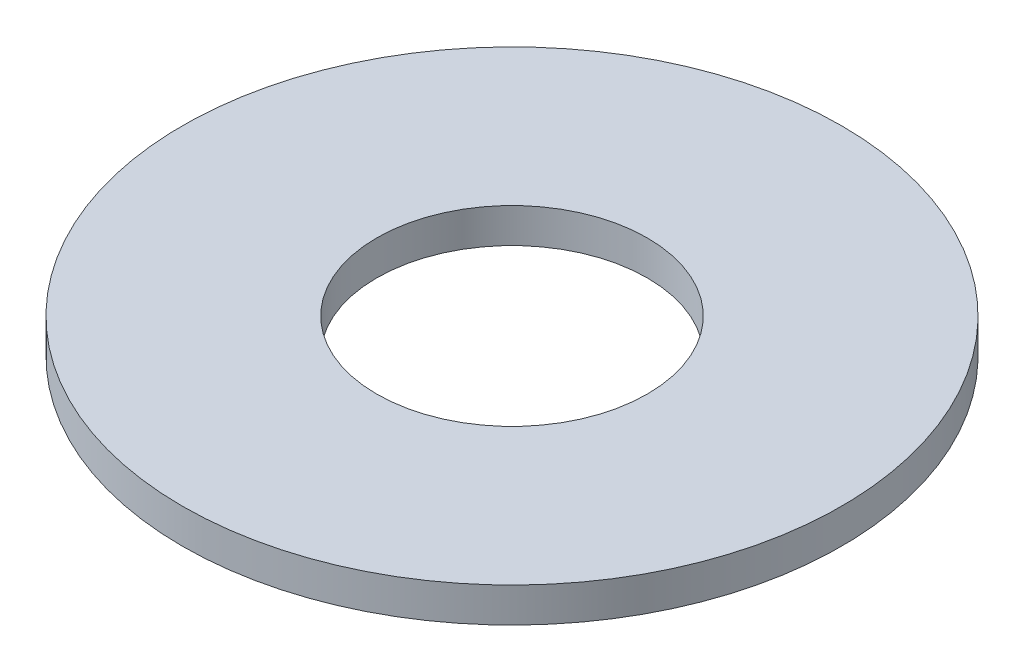
ISO-10303-21;
HEADER;
FILE_DESCRIPTION(('STEP AP214'),'2;1');
FILE_NAME('part.step','',(''),(''),'','','');
FILE_SCHEMA(('AUTOMOTIVE_DESIGN { 1 0 10303 214 1 1 1 1 }'));
ENDSEC;
DATA;
#1=APPLICATION_CONTEXT('core data for automotive mechanical design processes');
#2=APPLICATION_PROTOCOL_DEFINITION('international standard','automotive_design',2000,#1);
#3=PRODUCT_CONTEXT('',#1,'mechanical');
#4=PRODUCT('Part','Part','',(#3));
#5=PRODUCT_RELATED_PRODUCT_CATEGORY('part','',(#4));
#6=PRODUCT_DEFINITION_FORMATION('','',#4);
#7=PRODUCT_DEFINITION_CONTEXT('part definition',#1,'design');
#8=PRODUCT_DEFINITION('design','',#6,#7);
#9=PRODUCT_DEFINITION_SHAPE('','',#8);
#10=(LENGTH_UNIT() NAMED_UNIT(*) SI_UNIT(.MILLI.,.METRE.));
#11=(NAMED_UNIT(*) PLANE_ANGLE_UNIT() SI_UNIT($,.RADIAN.));
#12=(NAMED_UNIT(*) SI_UNIT($,.STERADIAN.) SOLID_ANGLE_UNIT());
#13=UNCERTAINTY_MEASURE_WITH_UNIT(LENGTH_MEASURE(1.E-05),#10,'distance_accuracy_value','');
#14=(GEOMETRIC_REPRESENTATION_CONTEXT(3) GLOBAL_UNCERTAINTY_ASSIGNED_CONTEXT((#13)) GLOBAL_UNIT_ASSIGNED_CONTEXT((#10,
#11,#12)) REPRESENTATION_CONTEXT('',''));
#15=CARTESIAN_POINT('',(0.,0.,0.));
#16=DIRECTION('',(0.,0.,1.));
#17=DIRECTION('',(1.,0.,0.));
#18=AXIS2_PLACEMENT_3D('',#15,#16,#17);
#19=CARTESIAN_POINT('',(0.,4.,0.));
#20=DIRECTION('',(0.,1.,0.));
#21=DIRECTION('',(0.,0.,1.));
#22=AXIS2_PLACEMENT_3D('',#19,#20,#21);
#23=PLANE('',#22);
#24=CARTESIAN_POINT('',(0.,4.,0.));
#25=DIRECTION('',(0.,1.,0.));
#26=DIRECTION('',(0.,0.,1.));
#27=AXIS2_PLACEMENT_3D('',#24,#25,#26);
#28=CIRCLE('',#27,38.);
#29=CARTESIAN_POINT('',(0.,4.,38.));
#30=VERTEX_POINT('',#29);
#31=EDGE_CURVE('E10',#30,#30,#28,.T.);
#32=ORIENTED_EDGE('',*,*,#31,.T.);
#33=EDGE_LOOP('',(#32));
#34=FACE_BOUND('',#33,.T.);
#35=CARTESIAN_POINT('',(0.,4.,0.));
#36=DIRECTION('',(0.,1.,0.));
#37=DIRECTION('',(0.,0.,1.));
#38=AXIS2_PLACEMENT_3D('',#35,#36,#37);
#39=CIRCLE('',#38,15.6);
#40=CARTESIAN_POINT('',(0.,4.,15.6));
#41=VERTEX_POINT('',#40);
#42=EDGE_CURVE('E42',#41,#41,#39,.T.);
#43=ORIENTED_EDGE('',*,*,#42,.F.);
#44=EDGE_LOOP('',(#43));
#45=FACE_BOUND('',#44,.T.);
#46=ADVANCED_FACE('F31',(#34,#45),#23,.T.);
#47=CARTESIAN_POINT('',(0.,0.,0.));
#48=DIRECTION('',(0.,1.,0.));
#49=DIRECTION('',(0.,0.,1.));
#50=AXIS2_PLACEMENT_3D('',#47,#48,#49);
#51=PLANE('',#50);
#52=CARTESIAN_POINT('',(0.,0.,0.));
#53=DIRECTION('',(0.,1.,0.));
#54=DIRECTION('',(0.,0.,1.));
#55=AXIS2_PLACEMENT_3D('',#52,#53,#54);
#56=CIRCLE('',#55,38.);
#57=CARTESIAN_POINT('',(0.,0.,38.));
#58=VERTEX_POINT('',#57);
#59=EDGE_CURVE('E35',#58,#58,#56,.T.);
#60=ORIENTED_EDGE('',*,*,#59,.F.);
#61=EDGE_LOOP('',(#60));
#62=FACE_BOUND('',#61,.T.);
#63=CARTESIAN_POINT('',(0.,0.,0.));
#64=DIRECTION('',(0.,1.,0.));
#65=DIRECTION('',(0.,0.,1.));
#66=AXIS2_PLACEMENT_3D('',#63,#64,#65);
#67=CIRCLE('',#66,15.6);
#68=CARTESIAN_POINT('',(0.,0.,15.6));
#69=VERTEX_POINT('',#68);
#70=EDGE_CURVE('E44',#69,#69,#67,.T.);
#71=ORIENTED_EDGE('',*,*,#70,.T.);
#72=EDGE_LOOP('',(#71));
#73=FACE_BOUND('',#72,.T.);
#74=ADVANCED_FACE('F54',(#62,#73),#51,.F.);
#75=CARTESIAN_POINT('',(0.,4.,0.));
#76=DIRECTION('',(0.,-1.,0.));
#77=DIRECTION('',(0.,0.,-1.));
#78=AXIS2_PLACEMENT_3D('',#75,#76,#77);
#79=CYLINDRICAL_SURFACE('',#78,38.);
#80=ORIENTED_EDGE('',*,*,#31,.F.);
#81=EDGE_LOOP('',(#80));
#82=FACE_BOUND('',#81,.T.);
#83=ORIENTED_EDGE('',*,*,#59,.T.);
#84=EDGE_LOOP('',(#83));
#85=FACE_BOUND('',#84,.T.);
#86=ADVANCED_FACE('F33',(#82,#85),#79,.T.);
#87=CARTESIAN_POINT('',(0.,4.,0.));
#88=DIRECTION('',(0.,-1.,0.));
#89=DIRECTION('',(0.,0.,-1.));
#90=AXIS2_PLACEMENT_3D('',#87,#88,#89);
#91=CYLINDRICAL_SURFACE('',#90,15.6);
#92=ORIENTED_EDGE('',*,*,#42,.T.);
#93=EDGE_LOOP('',(#92));
#94=FACE_BOUND('',#93,.T.);
#95=ORIENTED_EDGE('',*,*,#70,.F.);
#96=EDGE_LOOP('',(#95));
#97=FACE_BOUND('',#96,.T.);
#98=ADVANCED_FACE('F50',(#94,#97),#91,.F.);
#99=CLOSED_SHELL('',(#46,#74,#86,#98));
#100=MANIFOLD_SOLID_BREP('B2',#99);
#101=ADVANCED_BREP_SHAPE_REPRESENTATION('',(#18,#100),#14);
#102=SHAPE_DEFINITION_REPRESENTATION(#9,#101);
ENDSEC;
END-ISO-10303-21;
